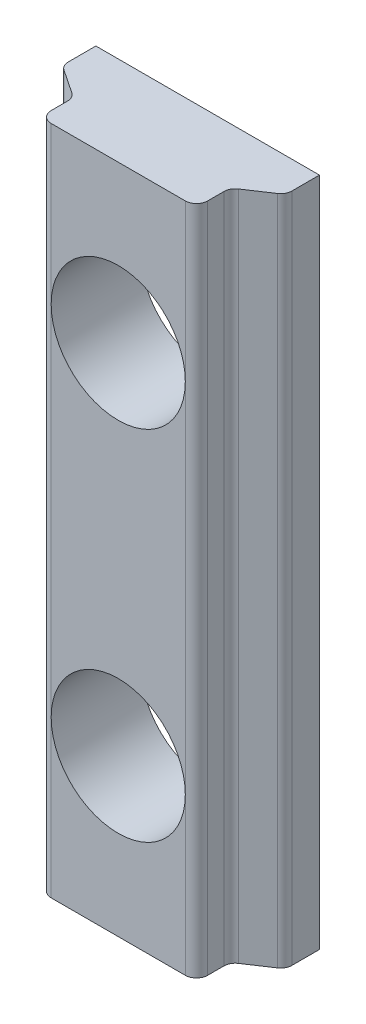
ISO-10303-21;
HEADER;
FILE_DESCRIPTION(('STEP AP214'),'2;1');
FILE_NAME('part.step','',(''),(''),'','','');
FILE_SCHEMA(('AUTOMOTIVE_DESIGN { 1 0 10303 214 1 1 1 1 }'));
ENDSEC;
DATA;
#1=APPLICATION_CONTEXT('core data for automotive mechanical design processes');
#2=APPLICATION_PROTOCOL_DEFINITION('international standard','automotive_design',2000,#1);
#3=PRODUCT_CONTEXT('',#1,'mechanical');
#4=PRODUCT('Part','Part','',(#3));
#5=PRODUCT_RELATED_PRODUCT_CATEGORY('part','',(#4));
#6=PRODUCT_DEFINITION_FORMATION('','',#4);
#7=PRODUCT_DEFINITION_CONTEXT('part definition',#1,'design');
#8=PRODUCT_DEFINITION('design','',#6,#7);
#9=PRODUCT_DEFINITION_SHAPE('','',#8);
#10=(LENGTH_UNIT() NAMED_UNIT(*) SI_UNIT(.MILLI.,.METRE.));
#11=(NAMED_UNIT(*) PLANE_ANGLE_UNIT() SI_UNIT($,.RADIAN.));
#12=(NAMED_UNIT(*) SI_UNIT($,.STERADIAN.) SOLID_ANGLE_UNIT());
#13=UNCERTAINTY_MEASURE_WITH_UNIT(LENGTH_MEASURE(1.E-05),#10,'distance_accuracy_value','');
#14=(GEOMETRIC_REPRESENTATION_CONTEXT(3) GLOBAL_UNCERTAINTY_ASSIGNED_CONTEXT((#13)) GLOBAL_UNIT_ASSIGNED_CONTEXT((#10,
#11,#12)) REPRESENTATION_CONTEXT('',''));
#15=CARTESIAN_POINT('',(0.,0.,0.));
#16=DIRECTION('',(0.,0.,1.));
#17=DIRECTION('',(1.,0.,0.));
#18=AXIS2_PLACEMENT_3D('',#15,#16,#17);
#19=CARTESIAN_POINT('',(3.5,30.,4.));
#20=DIRECTION('',(0.,0.,-1.));
#21=DIRECTION('',(-1.,0.,0.));
#22=AXIS2_PLACEMENT_3D('',#19,#20,#21);
#23=PLANE('',#22);
#24=DIRECTION('',(0.,-1.,0.));
#25=VECTOR('',#24,1.);
#26=CARTESIAN_POINT('',(-3.,30.,4.));
#27=LINE('',#26,#25);
#28=CARTESIAN_POINT('',(-3.,23.,4.));
#29=VERTEX_POINT('',#28);
#30=CARTESIAN_POINT('',(-3.,7.,4.));
#31=VERTEX_POINT('',#30);
#32=EDGE_CURVE('E158',#29,#31,#27,.T.);
#33=ORIENTED_EDGE('',*,*,#32,.T.);
#34=CARTESIAN_POINT('',(0.,7.,4.));
#35=DIRECTION('',(0.,0.,1.));
#36=DIRECTION('',(1.,0.,0.));
#37=AXIS2_PLACEMENT_3D('',#34,#35,#36);
#38=CIRCLE('',#37,3.);
#39=CARTESIAN_POINT('',(3.,7.,4.));
#40=VERTEX_POINT('',#39);
#41=EDGE_CURVE('E50',#40,#31,#38,.T.);
#42=ORIENTED_EDGE('',*,*,#41,.F.);
#43=DIRECTION('',(0.,-1.,0.));
#44=VECTOR('',#43,1.);
#45=CARTESIAN_POINT('',(3.,30.,4.));
#46=LINE('',#45,#44);
#47=CARTESIAN_POINT('',(3.,23.,4.));
#48=VERTEX_POINT('',#47);
#49=EDGE_CURVE('E156',#40,#48,#46,.F.);
#50=ORIENTED_EDGE('',*,*,#49,.T.);
#51=CARTESIAN_POINT('',(0.,23.,4.));
#52=DIRECTION('',(0.,0.,1.));
#53=DIRECTION('',(1.,0.,0.));
#54=AXIS2_PLACEMENT_3D('',#51,#52,#53);
#55=CIRCLE('',#54,3.);
#56=EDGE_CURVE('E273',#29,#48,#55,.T.);
#57=ORIENTED_EDGE('',*,*,#56,.F.);
#58=EDGE_LOOP('',(#33,#42,#50,#57));
#59=FACE_BOUND('',#58,.T.);
#60=ADVANCED_FACE('F36',(#59),#23,.F.);
#61=CARTESIAN_POINT('',(-3.,30.,4.));
#62=VERTEX_POINT('',#61);
#63=EDGE_CURVE('E173',#62,#29,#27,.T.);
#64=ORIENTED_EDGE('',*,*,#63,.T.);
#65=EDGE_CURVE('E57',#48,#29,#55,.T.);
#66=ORIENTED_EDGE('',*,*,#65,.F.);
#67=CARTESIAN_POINT('',(3.,30.,4.));
#68=VERTEX_POINT('',#67);
#69=EDGE_CURVE('E165',#48,#68,#46,.F.);
#70=ORIENTED_EDGE('',*,*,#69,.T.);
#71=DIRECTION('',(1.,0.,0.));
#72=VECTOR('',#71,1.);
#73=CARTESIAN_POINT('',(3.5,30.,4.));
#74=LINE('',#73,#72);
#75=EDGE_CURVE('E260',#62,#68,#74,.T.);
#76=ORIENTED_EDGE('',*,*,#75,.F.);
#77=EDGE_LOOP('',(#64,#66,#70,#76));
#78=FACE_BOUND('',#77,.T.);
#79=ADVANCED_FACE('F280',(#78),#23,.F.);
#80=CARTESIAN_POINT('',(-5.,30.,1.5));
#81=DIRECTION('',(1.,0.,0.));
#82=DIRECTION('',(0.,0.,-1.));
#83=AXIS2_PLACEMENT_3D('',#80,#81,#82);
#84=PLANE('',#83);
#85=DIRECTION('',(0.,0.,1.));
#86=VECTOR('',#85,1.);
#87=CARTESIAN_POINT('',(-5.,0.,1.5));
#88=LINE('',#87,#86);
#89=CARTESIAN_POINT('',(-5.,0.,0.));
#90=VERTEX_POINT('',#89);
#91=CARTESIAN_POINT('',(-5.,0.,1.232408120756));
#92=VERTEX_POINT('',#91);
#93=EDGE_CURVE('E248',#90,#92,#88,.T.);
#94=ORIENTED_EDGE('',*,*,#93,.T.);
#95=DIRECTION('',(0.,-1.,0.));
#96=VECTOR('',#95,1.);
#97=CARTESIAN_POINT('',(-5.,30.,1.232408120756));
#98=LINE('',#97,#96);
#99=CARTESIAN_POINT('',(-5.,30.,1.232408120756));
#100=VERTEX_POINT('',#99);
#101=EDGE_CURVE('E193',#92,#100,#98,.F.);
#102=ORIENTED_EDGE('',*,*,#101,.T.);
#103=DIRECTION('',(0.,0.,1.));
#104=VECTOR('',#103,1.);
#105=CARTESIAN_POINT('',(-5.,30.,1.5));
#106=LINE('',#105,#104);
#107=CARTESIAN_POINT('',(-5.,30.,0.));
#108=VERTEX_POINT('',#107);
#109=EDGE_CURVE('E233',#108,#100,#106,.T.);
#110=ORIENTED_EDGE('',*,*,#109,.F.);
#111=DIRECTION('',(0.,-1.,0.));
#112=VECTOR('',#111,1.);
#113=CARTESIAN_POINT('',(-5.,30.,0.));
#114=LINE('',#113,#112);
#115=EDGE_CURVE('E227',#108,#90,#114,.T.);
#116=ORIENTED_EDGE('',*,*,#115,.T.);
#117=EDGE_LOOP('',(#94,#102,#110,#116));
#118=FACE_BOUND('',#117,.T.);
#119=ADVANCED_FACE('F353',(#118),#84,.F.);
#120=CARTESIAN_POINT('',(-3.5,30.,2.5));
#121=DIRECTION('',(0.554700196225229,0.,-0.832050294337844));
#122=DIRECTION('',(-0.832050294337844,0.,-0.554700196225229));
#123=AXIS2_PLACEMENT_3D('',#120,#121,#122);
#124=PLANE('',#123);
#125=DIRECTION('',(0.832050294337844,0.,0.554700196225229));
#126=VECTOR('',#125,1.);
#127=CARTESIAN_POINT('',(-3.5,30.,2.5));
#128=LINE('',#127,#126);
#129=CARTESIAN_POINT('',(-4.77735009811262,30.,1.64843326792492));
#130=VERTEX_POINT('',#129);
#131=CARTESIAN_POINT('',(-3.72264990188739,30.,2.35156673207508));
#132=VERTEX_POINT('',#131);
#133=EDGE_CURVE('E265',#130,#132,#128,.T.);
#134=ORIENTED_EDGE('',*,*,#133,.F.);
#135=DIRECTION('',(0.,-1.,0.));
#136=VECTOR('',#135,1.);
#137=CARTESIAN_POINT('',(-4.77735009811262,30.,1.64843326792492));
#138=LINE('',#137,#136);
#139=CARTESIAN_POINT('',(-4.77735009811262,0.,1.64843326792492));
#140=VERTEX_POINT('',#139);
#141=EDGE_CURVE('E195',#130,#140,#138,.T.);
#142=ORIENTED_EDGE('',*,*,#141,.T.);
#143=DIRECTION('',(0.832050294337844,0.,0.554700196225229));
#144=VECTOR('',#143,1.);
#145=CARTESIAN_POINT('',(-3.5,0.,2.5));
#146=LINE('',#145,#144);
#147=CARTESIAN_POINT('',(-3.72264990188739,0.,2.35156673207508));
#148=VERTEX_POINT('',#147);
#149=EDGE_CURVE('E245',#140,#148,#146,.T.);
#150=ORIENTED_EDGE('',*,*,#149,.T.);
#151=DIRECTION('',(0.,-1.,0.));
#152=VECTOR('',#151,1.);
#153=CARTESIAN_POINT('',(-3.72264990188739,30.,2.35156673207508));
#154=LINE('',#153,#152);
#155=EDGE_CURVE('E198',#148,#132,#154,.F.);
#156=ORIENTED_EDGE('',*,*,#155,.T.);
#157=EDGE_LOOP('',(#134,#142,#150,#156));
#158=FACE_BOUND('',#157,.T.);
#159=ADVANCED_FACE('F328',(#158),#124,.F.);
#160=CARTESIAN_POINT('',(-3.5,30.,4.));
#161=DIRECTION('',(1.,0.,0.));
#162=DIRECTION('',(0.,0.,-1.));
#163=AXIS2_PLACEMENT_3D('',#160,#161,#162);
#164=PLANE('',#163);
#165=DIRECTION('',(0.,0.,1.));
#166=VECTOR('',#165,1.);
#167=CARTESIAN_POINT('',(-3.5,30.,4.));
#168=LINE('',#167,#166);
#169=CARTESIAN_POINT('',(-3.5,30.,2.767591879244));
#170=VERTEX_POINT('',#169);
#171=CARTESIAN_POINT('',(-3.5,30.,3.5));
#172=VERTEX_POINT('',#171);
#173=EDGE_CURVE('E262',#170,#172,#168,.T.);
#174=ORIENTED_EDGE('',*,*,#173,.F.);
#175=DIRECTION('',(0.,-1.,0.));
#176=VECTOR('',#175,1.);
#177=CARTESIAN_POINT('',(-3.5,0.,2.767591879244));
#178=LINE('',#177,#176);
#179=CARTESIAN_POINT('',(-3.5,0.,2.767591879244));
#180=VERTEX_POINT('',#179);
#181=EDGE_CURVE('E186',#170,#180,#178,.T.);
#182=ORIENTED_EDGE('',*,*,#181,.T.);
#183=DIRECTION('',(0.,0.,1.));
#184=VECTOR('',#183,1.);
#185=CARTESIAN_POINT('',(-3.5,0.,4.));
#186=LINE('',#185,#184);
#187=CARTESIAN_POINT('',(-3.5,0.,3.5));
#188=VERTEX_POINT('',#187);
#189=EDGE_CURVE('E242',#180,#188,#186,.T.);
#190=ORIENTED_EDGE('',*,*,#189,.T.);
#191=DIRECTION('',(0.,-1.,0.));
#192=VECTOR('',#191,1.);
#193=CARTESIAN_POINT('',(-3.5,30.,3.5));
#194=LINE('',#193,#192);
#195=EDGE_CURVE('E191',#188,#172,#194,.F.);
#196=ORIENTED_EDGE('',*,*,#195,.T.);
#197=EDGE_LOOP('',(#174,#182,#190,#196));
#198=FACE_BOUND('',#197,.T.);
#199=ADVANCED_FACE('F338',(#198),#164,.F.);
#200=CARTESIAN_POINT('',(3.,0.,4.));
#201=VERTEX_POINT('',#200);
#202=EDGE_CURVE('E164',#201,#40,#46,.F.);
#203=ORIENTED_EDGE('',*,*,#202,.T.);
#204=EDGE_CURVE('E146',#31,#40,#38,.T.);
#205=ORIENTED_EDGE('',*,*,#204,.F.);
#206=CARTESIAN_POINT('',(-3.,0.,4.));
#207=VERTEX_POINT('',#206);
#208=EDGE_CURVE('E171',#31,#207,#27,.T.);
#209=ORIENTED_EDGE('',*,*,#208,.T.);
#210=DIRECTION('',(1.,0.,0.));
#211=VECTOR('',#210,1.);
#212=CARTESIAN_POINT('',(3.5,0.,4.));
#213=LINE('',#212,#211);
#214=EDGE_CURVE('E170',#207,#201,#213,.T.);
#215=ORIENTED_EDGE('',*,*,#214,.T.);
#216=EDGE_LOOP('',(#203,#205,#209,#215));
#217=FACE_BOUND('',#216,.T.);
#218=ADVANCED_FACE('F168',(#217),#23,.F.);
#219=CARTESIAN_POINT('',(3.5,30.,2.5));
#220=DIRECTION('',(-1.,0.,0.));
#221=DIRECTION('',(0.,0.,1.));
#222=AXIS2_PLACEMENT_3D('',#219,#220,#221);
#223=PLANE('',#222);
#224=DIRECTION('',(0.,0.,-1.));
#225=VECTOR('',#224,1.);
#226=CARTESIAN_POINT('',(3.5,0.,2.5));
#227=LINE('',#226,#225);
#228=CARTESIAN_POINT('',(3.5,0.,3.5));
#229=VERTEX_POINT('',#228);
#230=CARTESIAN_POINT('',(3.5,0.,2.767591879244));
#231=VERTEX_POINT('',#230);
#232=EDGE_CURVE('E239',#229,#231,#227,.T.);
#233=ORIENTED_EDGE('',*,*,#232,.T.);
#234=DIRECTION('',(0.,-1.,0.));
#235=VECTOR('',#234,1.);
#236=CARTESIAN_POINT('',(3.5,30.,2.767591879244));
#237=LINE('',#236,#235);
#238=CARTESIAN_POINT('',(3.5,30.,2.767591879244));
#239=VERTEX_POINT('',#238);
#240=EDGE_CURVE('E175',#231,#239,#237,.F.);
#241=ORIENTED_EDGE('',*,*,#240,.T.);
#242=DIRECTION('',(0.,0.,-1.));
#243=VECTOR('',#242,1.);
#244=CARTESIAN_POINT('',(3.5,30.,2.5));
#245=LINE('',#244,#243);
#246=CARTESIAN_POINT('',(3.5,30.,3.5));
#247=VERTEX_POINT('',#246);
#248=EDGE_CURVE('E258',#247,#239,#245,.T.);
#249=ORIENTED_EDGE('',*,*,#248,.F.);
#250=DIRECTION('',(0.,-1.,0.));
#251=VECTOR('',#250,1.);
#252=CARTESIAN_POINT('',(3.5,30.,3.5));
#253=LINE('',#252,#251);
#254=EDGE_CURVE('E179',#247,#229,#253,.T.);
#255=ORIENTED_EDGE('',*,*,#254,.T.);
#256=EDGE_LOOP('',(#233,#241,#249,#255));
#257=FACE_BOUND('',#256,.T.);
#258=ADVANCED_FACE('F295',(#257),#223,.F.);
#259=CARTESIAN_POINT('',(5.,30.,1.5));
#260=DIRECTION('',(-0.554700196225229,0.,-0.832050294337844));
#261=DIRECTION('',(-0.832050294337844,0.,0.554700196225229));
#262=AXIS2_PLACEMENT_3D('',#259,#260,#261);
#263=PLANE('',#262);
#264=DIRECTION('',(0.832050294337844,0.,-0.554700196225229));
#265=VECTOR('',#264,1.);
#266=CARTESIAN_POINT('',(5.,0.,1.5));
#267=LINE('',#266,#265);
#268=CARTESIAN_POINT('',(3.72264990188739,0.,2.35156673207508));
#269=VERTEX_POINT('',#268);
#270=CARTESIAN_POINT('',(4.77735009811262,0.,1.64843326792492));
#271=VERTEX_POINT('',#270);
#272=EDGE_CURVE('E236',#269,#271,#267,.T.);
#273=ORIENTED_EDGE('',*,*,#272,.T.);
#274=DIRECTION('',(0.,-1.,0.));
#275=VECTOR('',#274,1.);
#276=CARTESIAN_POINT('',(4.77735009811262,30.,1.64843326792492));
#277=LINE('',#276,#275);
#278=CARTESIAN_POINT('',(4.77735009811262,30.,1.64843326792492));
#279=VERTEX_POINT('',#278);
#280=EDGE_CURVE('E208',#271,#279,#277,.F.);
#281=ORIENTED_EDGE('',*,*,#280,.T.);
#282=DIRECTION('',(0.832050294337844,0.,-0.554700196225229));
#283=VECTOR('',#282,1.);
#284=CARTESIAN_POINT('',(5.,30.,1.5));
#285=LINE('',#284,#283);
#286=CARTESIAN_POINT('',(3.72264990188739,30.,2.35156673207508));
#287=VERTEX_POINT('',#286);
#288=EDGE_CURVE('E255',#287,#279,#285,.T.);
#289=ORIENTED_EDGE('',*,*,#288,.F.);
#290=DIRECTION('',(0.,-1.,0.));
#291=VECTOR('',#290,1.);
#292=CARTESIAN_POINT('',(3.72264990188739,0.,2.35156673207508));
#293=LINE('',#292,#291);
#294=EDGE_CURVE('E210',#287,#269,#293,.T.);
#295=ORIENTED_EDGE('',*,*,#294,.T.);
#296=EDGE_LOOP('',(#273,#281,#289,#295));
#297=FACE_BOUND('',#296,.T.);
#298=ADVANCED_FACE('F304',(#297),#263,.F.);
#299=CARTESIAN_POINT('',(5.,30.,0.));
#300=DIRECTION('',(-1.,0.,0.));
#301=DIRECTION('',(0.,0.,1.));
#302=AXIS2_PLACEMENT_3D('',#299,#300,#301);
#303=PLANE('',#302);
#304=DIRECTION('',(0.,0.,-1.));
#305=VECTOR('',#304,1.);
#306=CARTESIAN_POINT('',(5.,30.,0.));
#307=LINE('',#306,#305);
#308=CARTESIAN_POINT('',(5.,30.,1.232408120756));
#309=VERTEX_POINT('',#308);
#310=CARTESIAN_POINT('',(5.,30.,0.));
#311=VERTEX_POINT('',#310);
#312=EDGE_CURVE('E253',#309,#311,#307,.T.);
#313=ORIENTED_EDGE('',*,*,#312,.F.);
#314=DIRECTION('',(0.,-1.,0.));
#315=VECTOR('',#314,1.);
#316=CARTESIAN_POINT('',(5.,30.,1.232408120756));
#317=LINE('',#316,#315);
#318=CARTESIAN_POINT('',(5.,0.,1.232408120756));
#319=VERTEX_POINT('',#318);
#320=EDGE_CURVE('E221',#309,#319,#317,.T.);
#321=ORIENTED_EDGE('',*,*,#320,.T.);
#322=DIRECTION('',(0.,0.,-1.));
#323=VECTOR('',#322,1.);
#324=CARTESIAN_POINT('',(5.,0.,0.));
#325=LINE('',#324,#323);
#326=CARTESIAN_POINT('',(5.,0.,0.));
#327=VERTEX_POINT('',#326);
#328=EDGE_CURVE('E234',#319,#327,#325,.T.);
#329=ORIENTED_EDGE('',*,*,#328,.T.);
#330=DIRECTION('',(0.,-1.,0.));
#331=VECTOR('',#330,1.);
#332=CARTESIAN_POINT('',(5.,30.,0.));
#333=LINE('',#332,#331);
#334=EDGE_CURVE('E224',#311,#327,#333,.T.);
#335=ORIENTED_EDGE('',*,*,#334,.F.);
#336=EDGE_LOOP('',(#313,#321,#329,#335));
#337=FACE_BOUND('',#336,.T.);
#338=ADVANCED_FACE('F312',(#337),#303,.F.);
#339=CARTESIAN_POINT('',(-5.,30.,0.));
#340=DIRECTION('',(0.,0.,1.));
#341=DIRECTION('',(1.,0.,0.));
#342=AXIS2_PLACEMENT_3D('',#339,#340,#341);
#343=PLANE('',#342);
#344=CARTESIAN_POINT('',(0.,7.,0.));
#345=DIRECTION('',(0.,0.,1.));
#346=DIRECTION('',(1.,0.,0.));
#347=AXIS2_PLACEMENT_3D('',#344,#345,#346);
#348=CIRCLE('',#347,3.);
#349=CARTESIAN_POINT('',(3.,7.,0.));
#350=VERTEX_POINT('',#349);
#351=EDGE_CURVE('E159',#350,#350,#348,.T.);
#352=ORIENTED_EDGE('',*,*,#351,.T.);
#353=EDGE_LOOP('',(#352));
#354=FACE_BOUND('',#353,.T.);
#355=CARTESIAN_POINT('',(0.,23.,0.));
#356=DIRECTION('',(0.,0.,1.));
#357=DIRECTION('',(1.,0.,0.));
#358=AXIS2_PLACEMENT_3D('',#355,#356,#357);
#359=CIRCLE('',#358,3.);
#360=CARTESIAN_POINT('',(3.,23.,0.));
#361=VERTEX_POINT('',#360);
#362=EDGE_CURVE('E251',#361,#361,#359,.T.);
#363=ORIENTED_EDGE('',*,*,#362,.T.);
#364=EDGE_LOOP('',(#363));
#365=FACE_BOUND('',#364,.T.);
#366=DIRECTION('',(-1.,0.,0.));
#367=VECTOR('',#366,1.);
#368=CARTESIAN_POINT('',(-5.,0.,0.));
#369=LINE('',#368,#367);
#370=EDGE_CURVE('E231',#327,#90,#369,.T.);
#371=ORIENTED_EDGE('',*,*,#370,.T.);
#372=ORIENTED_EDGE('',*,*,#115,.F.);
#373=DIRECTION('',(-1.,0.,0.));
#374=VECTOR('',#373,1.);
#375=CARTESIAN_POINT('',(-5.,30.,0.));
#376=LINE('',#375,#374);
#377=EDGE_CURVE('E230',#311,#108,#376,.T.);
#378=ORIENTED_EDGE('',*,*,#377,.F.);
#379=ORIENTED_EDGE('',*,*,#334,.T.);
#380=EDGE_LOOP('',(#371,#372,#378,#379));
#381=FACE_BOUND('',#380,.T.);
#382=ADVANCED_FACE('F317',(#354,#365,#381),#343,.F.);
#383=CARTESIAN_POINT('',(0.,30.,0.));
#384=DIRECTION('',(0.,-1.,0.));
#385=DIRECTION('',(0.,0.,-1.));
#386=AXIS2_PLACEMENT_3D('',#383,#384,#385);
#387=PLANE('',#386);
#388=ORIENTED_EDGE('',*,*,#288,.T.);
#389=CARTESIAN_POINT('',(4.5,30.,1.232408120756));
#390=DIRECTION('',(0.,-1.,0.));
#391=DIRECTION('',(0.,0.,-1.));
#392=AXIS2_PLACEMENT_3D('',#389,#390,#391);
#393=CIRCLE('',#392,0.5);
#394=EDGE_CURVE('E200',#279,#309,#393,.F.);
#395=ORIENTED_EDGE('',*,*,#394,.T.);
#396=ORIENTED_EDGE('',*,*,#312,.T.);
#397=ORIENTED_EDGE('',*,*,#377,.T.);
#398=ORIENTED_EDGE('',*,*,#109,.T.);
#399=CARTESIAN_POINT('',(-4.5,30.,1.232408120756));
#400=DIRECTION('',(0.,-1.,0.));
#401=DIRECTION('',(0.,0.,-1.));
#402=AXIS2_PLACEMENT_3D('',#399,#400,#401);
#403=CIRCLE('',#402,0.5);
#404=EDGE_CURVE('E202',#100,#130,#403,.F.);
#405=ORIENTED_EDGE('',*,*,#404,.T.);
#406=ORIENTED_EDGE('',*,*,#133,.T.);
#407=CARTESIAN_POINT('',(-4.,30.,2.767591879244));
#408=DIRECTION('',(0.,-1.,0.));
#409=DIRECTION('',(0.,0.,-1.));
#410=AXIS2_PLACEMENT_3D('',#407,#408,#409);
#411=CIRCLE('',#410,0.5);
#412=EDGE_CURVE('E285',#132,#170,#411,.T.);
#413=ORIENTED_EDGE('',*,*,#412,.T.);
#414=ORIENTED_EDGE('',*,*,#173,.T.);
#415=CARTESIAN_POINT('',(-3.,30.,3.5));
#416=DIRECTION('',(0.,-1.,0.));
#417=DIRECTION('',(0.,0.,-1.));
#418=AXIS2_PLACEMENT_3D('',#415,#416,#417);
#419=CIRCLE('',#418,0.5);
#420=EDGE_CURVE('E204',#172,#62,#419,.F.);
#421=ORIENTED_EDGE('',*,*,#420,.T.);
#422=ORIENTED_EDGE('',*,*,#75,.T.);
#423=CARTESIAN_POINT('',(3.,30.,3.5));
#424=DIRECTION('',(0.,-1.,0.));
#425=DIRECTION('',(0.,0.,-1.));
#426=AXIS2_PLACEMENT_3D('',#423,#424,#425);
#427=CIRCLE('',#426,0.5);
#428=EDGE_CURVE('E206',#68,#247,#427,.F.);
#429=ORIENTED_EDGE('',*,*,#428,.T.);
#430=ORIENTED_EDGE('',*,*,#248,.T.);
#431=CARTESIAN_POINT('',(4.,30.,2.767591879244));
#432=DIRECTION('',(0.,-1.,0.));
#433=DIRECTION('',(0.,0.,-1.));
#434=AXIS2_PLACEMENT_3D('',#431,#432,#433);
#435=CIRCLE('',#434,0.5);
#436=EDGE_CURVE('E11',#239,#287,#435,.T.);
#437=ORIENTED_EDGE('',*,*,#436,.T.);
#438=EDGE_LOOP('',(#388,#395,#396,#397,#398,#405,#406,#413,#414,#421,#422,#429,#430,#437));
#439=FACE_BOUND('',#438,.T.);
#440=ADVANCED_FACE('F301',(#439),#387,.F.);
#441=CARTESIAN_POINT('',(0.,0.,0.));
#442=DIRECTION('',(0.,-1.,0.));
#443=DIRECTION('',(0.,0.,-1.));
#444=AXIS2_PLACEMENT_3D('',#441,#442,#443);
#445=PLANE('',#444);
#446=ORIENTED_EDGE('',*,*,#328,.F.);
#447=CARTESIAN_POINT('',(4.5,0.,1.232408120756));
#448=DIRECTION('',(0.,-1.,0.));
#449=DIRECTION('',(0.,0.,-1.));
#450=AXIS2_PLACEMENT_3D('',#447,#448,#449);
#451=CIRCLE('',#450,0.5);
#452=EDGE_CURVE('E213',#319,#271,#451,.T.);
#453=ORIENTED_EDGE('',*,*,#452,.T.);
#454=ORIENTED_EDGE('',*,*,#272,.F.);
#455=CARTESIAN_POINT('',(4.,0.,2.767591879244));
#456=DIRECTION('',(0.,-1.,0.));
#457=DIRECTION('',(0.,0.,-1.));
#458=AXIS2_PLACEMENT_3D('',#455,#456,#457);
#459=CIRCLE('',#458,0.5);
#460=EDGE_CURVE('E44',#269,#231,#459,.F.);
#461=ORIENTED_EDGE('',*,*,#460,.T.);
#462=ORIENTED_EDGE('',*,*,#232,.F.);
#463=CARTESIAN_POINT('',(3.,0.,3.5));
#464=DIRECTION('',(0.,-1.,0.));
#465=DIRECTION('',(0.,0.,-1.));
#466=AXIS2_PLACEMENT_3D('',#463,#464,#465);
#467=CIRCLE('',#466,0.5);
#468=EDGE_CURVE('E219',#229,#201,#467,.T.);
#469=ORIENTED_EDGE('',*,*,#468,.T.);
#470=ORIENTED_EDGE('',*,*,#214,.F.);
#471=CARTESIAN_POINT('',(-3.,0.,3.5));
#472=DIRECTION('',(0.,-1.,0.));
#473=DIRECTION('',(0.,0.,-1.));
#474=AXIS2_PLACEMENT_3D('',#471,#472,#473);
#475=CIRCLE('',#474,0.5);
#476=EDGE_CURVE('E217',#207,#188,#475,.T.);
#477=ORIENTED_EDGE('',*,*,#476,.T.);
#478=ORIENTED_EDGE('',*,*,#189,.F.);
#479=CARTESIAN_POINT('',(-4.,0.,2.767591879244));
#480=DIRECTION('',(0.,-1.,0.));
#481=DIRECTION('',(0.,0.,-1.));
#482=AXIS2_PLACEMENT_3D('',#479,#480,#481);
#483=CIRCLE('',#482,0.5);
#484=EDGE_CURVE('E284',#180,#148,#483,.F.);
#485=ORIENTED_EDGE('',*,*,#484,.T.);
#486=ORIENTED_EDGE('',*,*,#149,.F.);
#487=CARTESIAN_POINT('',(-4.5,0.,1.232408120756));
#488=DIRECTION('',(0.,-1.,0.));
#489=DIRECTION('',(0.,0.,-1.));
#490=AXIS2_PLACEMENT_3D('',#487,#488,#489);
#491=CIRCLE('',#490,0.5);
#492=EDGE_CURVE('E215',#140,#92,#491,.T.);
#493=ORIENTED_EDGE('',*,*,#492,.T.);
#494=ORIENTED_EDGE('',*,*,#93,.F.);
#495=ORIENTED_EDGE('',*,*,#370,.F.);
#496=EDGE_LOOP('',(#446,#453,#454,#461,#462,#469,#470,#477,#478,#485,#486,#493,#494,#495));
#497=FACE_BOUND('',#496,.T.);
#498=ADVANCED_FACE('F292',(#497),#445,.T.);
#499=CARTESIAN_POINT('',(4.5,30.,1.232408120756));
#500=DIRECTION('',(0.,-1.,0.));
#501=DIRECTION('',(0.,0.,-1.));
#502=AXIS2_PLACEMENT_3D('',#499,#500,#501);
#503=CYLINDRICAL_SURFACE('',#502,0.5);
#504=ORIENTED_EDGE('',*,*,#394,.F.);
#505=ORIENTED_EDGE('',*,*,#280,.F.);
#506=ORIENTED_EDGE('',*,*,#452,.F.);
#507=ORIENTED_EDGE('',*,*,#320,.F.);
#508=EDGE_LOOP('',(#504,#505,#506,#507));
#509=FACE_BOUND('',#508,.T.);
#510=ADVANCED_FACE('F307',(#509),#503,.T.);
#511=CARTESIAN_POINT('',(-4.5,30.,1.232408120756));
#512=DIRECTION('',(0.,-1.,0.));
#513=DIRECTION('',(0.,0.,-1.));
#514=AXIS2_PLACEMENT_3D('',#511,#512,#513);
#515=CYLINDRICAL_SURFACE('',#514,0.5);
#516=ORIENTED_EDGE('',*,*,#404,.F.);
#517=ORIENTED_EDGE('',*,*,#101,.F.);
#518=ORIENTED_EDGE('',*,*,#492,.F.);
#519=ORIENTED_EDGE('',*,*,#141,.F.);
#520=EDGE_LOOP('',(#516,#517,#518,#519));
#521=FACE_BOUND('',#520,.T.);
#522=ADVANCED_FACE('F325',(#521),#515,.T.);
#523=CARTESIAN_POINT('',(-4.,30.,2.767591879244));
#524=DIRECTION('',(0.,1.,0.));
#525=DIRECTION('',(0.,0.,1.));
#526=AXIS2_PLACEMENT_3D('',#523,#524,#525);
#527=CYLINDRICAL_SURFACE('',#526,0.5);
#528=ORIENTED_EDGE('',*,*,#412,.F.);
#529=ORIENTED_EDGE('',*,*,#155,.F.);
#530=ORIENTED_EDGE('',*,*,#484,.F.);
#531=ORIENTED_EDGE('',*,*,#181,.F.);
#532=EDGE_LOOP('',(#528,#529,#530,#531));
#533=FACE_BOUND('',#532,.T.);
#534=ADVANCED_FACE('F335',(#533),#527,.F.);
#535=CARTESIAN_POINT('',(4.,30.,2.767591879244));
#536=DIRECTION('',(0.,1.,0.));
#537=DIRECTION('',(0.,0.,1.));
#538=AXIS2_PLACEMENT_3D('',#535,#536,#537);
#539=CYLINDRICAL_SURFACE('',#538,0.5);
#540=ORIENTED_EDGE('',*,*,#436,.F.);
#541=ORIENTED_EDGE('',*,*,#240,.F.);
#542=ORIENTED_EDGE('',*,*,#460,.F.);
#543=ORIENTED_EDGE('',*,*,#294,.F.);
#544=EDGE_LOOP('',(#540,#541,#542,#543));
#545=FACE_BOUND('',#544,.T.);
#546=ADVANCED_FACE('F298',(#545),#539,.F.);
#547=CARTESIAN_POINT('',(-3.,30.,3.5));
#548=DIRECTION('',(0.,-1.,0.));
#549=DIRECTION('',(0.,0.,-1.));
#550=AXIS2_PLACEMENT_3D('',#547,#548,#549);
#551=CYLINDRICAL_SURFACE('',#550,0.5);
#552=ORIENTED_EDGE('',*,*,#420,.F.);
#553=ORIENTED_EDGE('',*,*,#195,.F.);
#554=ORIENTED_EDGE('',*,*,#476,.F.);
#555=ORIENTED_EDGE('',*,*,#208,.F.);
#556=ORIENTED_EDGE('',*,*,#32,.F.);
#557=ORIENTED_EDGE('',*,*,#63,.F.);
#558=EDGE_LOOP('',(#552,#553,#554,#555,#556,#557));
#559=FACE_BOUND('',#558,.T.);
#560=ADVANCED_FACE('F340',(#559),#551,.T.);
#561=CARTESIAN_POINT('',(3.,30.,3.5));
#562=DIRECTION('',(0.,-1.,0.));
#563=DIRECTION('',(0.,0.,-1.));
#564=AXIS2_PLACEMENT_3D('',#561,#562,#563);
#565=CYLINDRICAL_SURFACE('',#564,0.5);
#566=ORIENTED_EDGE('',*,*,#428,.F.);
#567=ORIENTED_EDGE('',*,*,#69,.F.);
#568=ORIENTED_EDGE('',*,*,#49,.F.);
#569=ORIENTED_EDGE('',*,*,#202,.F.);
#570=ORIENTED_EDGE('',*,*,#468,.F.);
#571=ORIENTED_EDGE('',*,*,#254,.F.);
#572=EDGE_LOOP('',(#566,#567,#568,#569,#570,#571));
#573=FACE_BOUND('',#572,.T.);
#574=ADVANCED_FACE('F38',(#573),#565,.T.);
#575=CARTESIAN_POINT('',(0.,23.,-26.));
#576=DIRECTION('',(0.,0.,1.));
#577=DIRECTION('',(1.,0.,0.));
#578=AXIS2_PLACEMENT_3D('',#575,#576,#577);
#579=CYLINDRICAL_SURFACE('',#578,3.);
#580=ORIENTED_EDGE('',*,*,#65,.T.);
#581=ORIENTED_EDGE('',*,*,#56,.T.);
#582=EDGE_LOOP('',(#580,#581));
#583=FACE_BOUND('',#582,.T.);
#584=ORIENTED_EDGE('',*,*,#362,.F.);
#585=EDGE_LOOP('',(#584));
#586=FACE_BOUND('',#585,.T.);
#587=ADVANCED_FACE('F277',(#583,#586),#579,.F.);
#588=CARTESIAN_POINT('',(0.,7.,-26.));
#589=DIRECTION('',(0.,0.,1.));
#590=DIRECTION('',(1.,0.,0.));
#591=AXIS2_PLACEMENT_3D('',#588,#589,#590);
#592=CYLINDRICAL_SURFACE('',#591,3.);
#593=ORIENTED_EDGE('',*,*,#41,.T.);
#594=ORIENTED_EDGE('',*,*,#204,.T.);
#595=EDGE_LOOP('',(#593,#594));
#596=FACE_BOUND('',#595,.T.);
#597=ORIENTED_EDGE('',*,*,#351,.F.);
#598=EDGE_LOOP('',(#597));
#599=FACE_BOUND('',#598,.T.);
#600=ADVANCED_FACE('F147',(#596,#599),#592,.F.);
#601=CLOSED_SHELL('',(#60,#79,#119,#159,#199,#218,#258,#298,#338,#382,#440,#498,#510,#522,#534,
#546,#560,#574,#587,#600));
#602=MANIFOLD_SOLID_BREP('B2',#601);
#603=ADVANCED_BREP_SHAPE_REPRESENTATION('',(#18,#602),#14);
#604=SHAPE_DEFINITION_REPRESENTATION(#9,#603);
ENDSEC;
END-ISO-10303-21;
